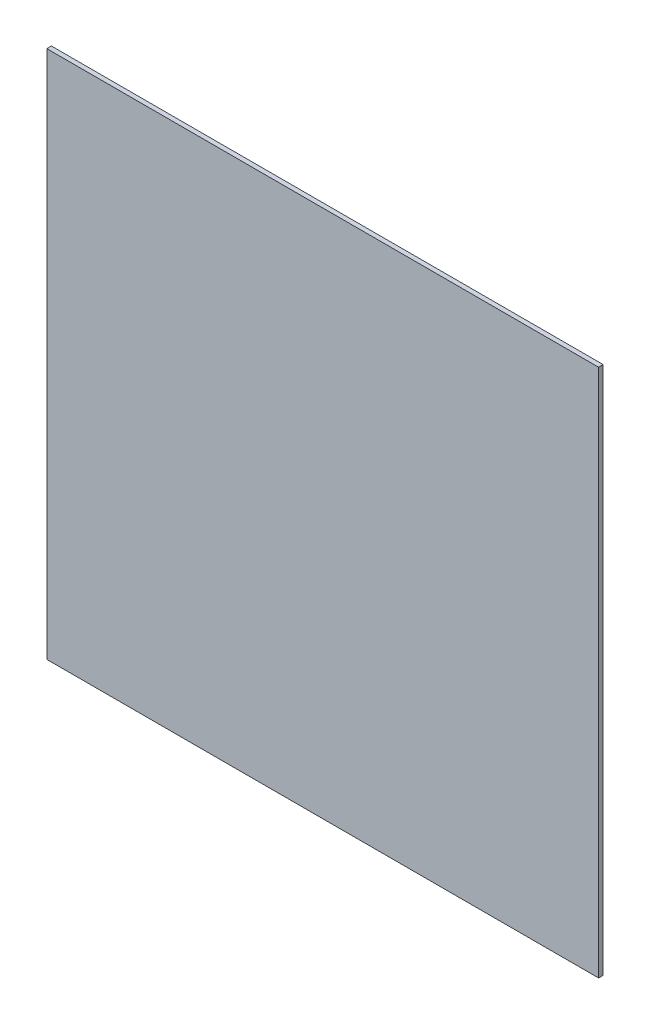
ISO-10303-21;
HEADER;
FILE_DESCRIPTION(('STEP AP214'),'2;1');
FILE_NAME('part.step','',(''),(''),'','','');
FILE_SCHEMA(('AUTOMOTIVE_DESIGN { 1 0 10303 214 1 1 1 1 }'));
ENDSEC;
DATA;
#1=APPLICATION_CONTEXT('core data for automotive mechanical design processes');
#2=APPLICATION_PROTOCOL_DEFINITION('international standard','automotive_design',2000,#1);
#3=PRODUCT_CONTEXT('',#1,'mechanical');
#4=PRODUCT('Part','Part','',(#3));
#5=PRODUCT_RELATED_PRODUCT_CATEGORY('part','',(#4));
#6=PRODUCT_DEFINITION_FORMATION('','',#4);
#7=PRODUCT_DEFINITION_CONTEXT('part definition',#1,'design');
#8=PRODUCT_DEFINITION('design','',#6,#7);
#9=PRODUCT_DEFINITION_SHAPE('','',#8);
#10=(LENGTH_UNIT() NAMED_UNIT(*) SI_UNIT(.MILLI.,.METRE.));
#11=(NAMED_UNIT(*) PLANE_ANGLE_UNIT() SI_UNIT($,.RADIAN.));
#12=(NAMED_UNIT(*) SI_UNIT($,.STERADIAN.) SOLID_ANGLE_UNIT());
#13=UNCERTAINTY_MEASURE_WITH_UNIT(LENGTH_MEASURE(1.E-05),#10,'distance_accuracy_value','');
#14=(GEOMETRIC_REPRESENTATION_CONTEXT(3) GLOBAL_UNCERTAINTY_ASSIGNED_CONTEXT((#13)) GLOBAL_UNIT_ASSIGNED_CONTEXT((#10,
#11,#12)) REPRESENTATION_CONTEXT('',''));
#15=CARTESIAN_POINT('',(0.,0.,0.));
#16=DIRECTION('',(0.,0.,1.));
#17=DIRECTION('',(1.,0.,0.));
#18=AXIS2_PLACEMENT_3D('',#15,#16,#17);
#19=CARTESIAN_POINT('',(302.5,290.,5.));
#20=DIRECTION('',(-1.,0.,0.));
#21=DIRECTION('',(0.,-1.,0.));
#22=AXIS2_PLACEMENT_3D('',#19,#20,#21);
#23=PLANE('',#22);
#24=DIRECTION('',(0.,1.,0.));
#25=VECTOR('',#24,1.);
#26=CARTESIAN_POINT('',(302.5,290.,0.));
#27=LINE('',#26,#25);
#28=CARTESIAN_POINT('',(302.5,-290.,0.));
#29=VERTEX_POINT('',#28);
#30=CARTESIAN_POINT('',(302.5,290.,0.));
#31=VERTEX_POINT('',#30);
#32=EDGE_CURVE('E96',#29,#31,#27,.T.);
#33=ORIENTED_EDGE('',*,*,#32,.T.);
#34=DIRECTION('',(0.,0.,-1.));
#35=VECTOR('',#34,1.);
#36=CARTESIAN_POINT('',(302.5,290.,5.));
#37=LINE('',#36,#35);
#38=CARTESIAN_POINT('',(302.5,290.,5.));
#39=VERTEX_POINT('',#38);
#40=EDGE_CURVE('E11',#39,#31,#37,.T.);
#41=ORIENTED_EDGE('',*,*,#40,.F.);
#42=DIRECTION('',(0.,1.,0.));
#43=VECTOR('',#42,1.);
#44=CARTESIAN_POINT('',(302.5,290.,5.));
#45=LINE('',#44,#43);
#46=CARTESIAN_POINT('',(302.5,-290.,5.));
#47=VERTEX_POINT('',#46);
#48=EDGE_CURVE('E84',#47,#39,#45,.T.);
#49=ORIENTED_EDGE('',*,*,#48,.F.);
#50=DIRECTION('',(0.,0.,-1.));
#51=VECTOR('',#50,1.);
#52=CARTESIAN_POINT('',(302.5,-290.,5.));
#53=LINE('',#52,#51);
#54=EDGE_CURVE('E92',#47,#29,#53,.T.);
#55=ORIENTED_EDGE('',*,*,#54,.T.);
#56=EDGE_LOOP('',(#33,#41,#49,#55));
#57=FACE_BOUND('',#56,.T.);
#58=ADVANCED_FACE('F33',(#57),#23,.F.);
#59=CARTESIAN_POINT('',(-302.5,290.,5.));
#60=DIRECTION('',(0.,-1.,0.));
#61=DIRECTION('',(0.,0.,-1.));
#62=AXIS2_PLACEMENT_3D('',#59,#60,#61);
#63=PLANE('',#62);
#64=DIRECTION('',(-1.,0.,0.));
#65=VECTOR('',#64,1.);
#66=CARTESIAN_POINT('',(-302.5,290.,0.));
#67=LINE('',#66,#65);
#68=CARTESIAN_POINT('',(-302.5,290.,0.));
#69=VERTEX_POINT('',#68);
#70=EDGE_CURVE('E88',#31,#69,#67,.T.);
#71=ORIENTED_EDGE('',*,*,#70,.T.);
#72=DIRECTION('',(0.,0.,-1.));
#73=VECTOR('',#72,1.);
#74=CARTESIAN_POINT('',(-302.5,290.,5.));
#75=LINE('',#74,#73);
#76=CARTESIAN_POINT('',(-302.5,290.,5.));
#77=VERTEX_POINT('',#76);
#78=EDGE_CURVE('E41',#77,#69,#75,.T.);
#79=ORIENTED_EDGE('',*,*,#78,.F.);
#80=DIRECTION('',(-1.,0.,0.));
#81=VECTOR('',#80,1.);
#82=CARTESIAN_POINT('',(-302.5,290.,5.));
#83=LINE('',#82,#81);
#84=EDGE_CURVE('E79',#39,#77,#83,.T.);
#85=ORIENTED_EDGE('',*,*,#84,.F.);
#86=ORIENTED_EDGE('',*,*,#40,.T.);
#87=EDGE_LOOP('',(#71,#79,#85,#86));
#88=FACE_BOUND('',#87,.T.);
#89=ADVANCED_FACE('F87',(#88),#63,.F.);
#90=CARTESIAN_POINT('',(-302.5,290.,5.));
#91=DIRECTION('',(1.,0.,0.));
#92=DIRECTION('',(0.,1.,0.));
#93=AXIS2_PLACEMENT_3D('',#90,#91,#92);
#94=PLANE('',#93);
#95=DIRECTION('',(0.,-1.,0.));
#96=VECTOR('',#95,1.);
#97=CARTESIAN_POINT('',(-302.5,290.,0.));
#98=LINE('',#97,#96);
#99=CARTESIAN_POINT('',(-302.5,-290.,0.));
#100=VERTEX_POINT('',#99);
#101=EDGE_CURVE('E66',#69,#100,#98,.T.);
#102=ORIENTED_EDGE('',*,*,#101,.T.);
#103=DIRECTION('',(0.,0.,-1.));
#104=VECTOR('',#103,1.);
#105=CARTESIAN_POINT('',(-302.5,-290.,5.));
#106=LINE('',#105,#104);
#107=CARTESIAN_POINT('',(-302.5,-290.,5.));
#108=VERTEX_POINT('',#107);
#109=EDGE_CURVE('E89',#108,#100,#106,.T.);
#110=ORIENTED_EDGE('',*,*,#109,.F.);
#111=DIRECTION('',(0.,-1.,0.));
#112=VECTOR('',#111,1.);
#113=CARTESIAN_POINT('',(-302.5,290.,5.));
#114=LINE('',#113,#112);
#115=EDGE_CURVE('E82',#77,#108,#114,.T.);
#116=ORIENTED_EDGE('',*,*,#115,.F.);
#117=ORIENTED_EDGE('',*,*,#78,.T.);
#118=EDGE_LOOP('',(#102,#110,#116,#117));
#119=FACE_BOUND('',#118,.T.);
#120=ADVANCED_FACE('F90',(#119),#94,.F.);
#121=CARTESIAN_POINT('',(-302.5,-290.,5.));
#122=DIRECTION('',(0.,1.,0.));
#123=DIRECTION('',(0.,0.,1.));
#124=AXIS2_PLACEMENT_3D('',#121,#122,#123);
#125=PLANE('',#124);
#126=DIRECTION('',(1.,0.,0.));
#127=VECTOR('',#126,1.);
#128=CARTESIAN_POINT('',(-302.5,-290.,0.));
#129=LINE('',#128,#127);
#130=EDGE_CURVE('E72',#100,#29,#129,.T.);
#131=ORIENTED_EDGE('',*,*,#130,.T.);
#132=ORIENTED_EDGE('',*,*,#54,.F.);
#133=DIRECTION('',(1.,0.,0.));
#134=VECTOR('',#133,1.);
#135=CARTESIAN_POINT('',(-302.5,-290.,5.));
#136=LINE('',#135,#134);
#137=EDGE_CURVE('E49',#108,#47,#136,.T.);
#138=ORIENTED_EDGE('',*,*,#137,.F.);
#139=ORIENTED_EDGE('',*,*,#109,.T.);
#140=EDGE_LOOP('',(#131,#132,#138,#139));
#141=FACE_BOUND('',#140,.T.);
#142=ADVANCED_FACE('F103',(#141),#125,.F.);
#143=CARTESIAN_POINT('',(0.,0.,5.));
#144=DIRECTION('',(0.,0.,1.));
#145=DIRECTION('',(1.,0.,0.));
#146=AXIS2_PLACEMENT_3D('',#143,#144,#145);
#147=PLANE('',#146);
#148=ORIENTED_EDGE('',*,*,#48,.T.);
#149=ORIENTED_EDGE('',*,*,#84,.T.);
#150=ORIENTED_EDGE('',*,*,#115,.T.);
#151=ORIENTED_EDGE('',*,*,#137,.T.);
#152=EDGE_LOOP('',(#148,#149,#150,#151));
#153=FACE_BOUND('',#152,.T.);
#154=ADVANCED_FACE('F80',(#153),#147,.T.);
#155=CARTESIAN_POINT('',(0.,0.,0.));
#156=DIRECTION('',(0.,0.,1.));
#157=DIRECTION('',(1.,0.,0.));
#158=AXIS2_PLACEMENT_3D('',#155,#156,#157);
#159=PLANE('',#158);
#160=ORIENTED_EDGE('',*,*,#32,.F.);
#161=ORIENTED_EDGE('',*,*,#130,.F.);
#162=ORIENTED_EDGE('',*,*,#101,.F.);
#163=ORIENTED_EDGE('',*,*,#70,.F.);
#164=EDGE_LOOP('',(#160,#161,#162,#163));
#165=FACE_BOUND('',#164,.T.);
#166=ADVANCED_FACE('F106',(#165),#159,.F.);
#167=CLOSED_SHELL('',(#58,#89,#120,#142,#154,#166));
#168=MANIFOLD_SOLID_BREP('B2',#167);
#169=ADVANCED_BREP_SHAPE_REPRESENTATION('',(#18,#168),#14);
#170=SHAPE_DEFINITION_REPRESENTATION(#9,#169);
ENDSEC;
END-ISO-10303-21;
